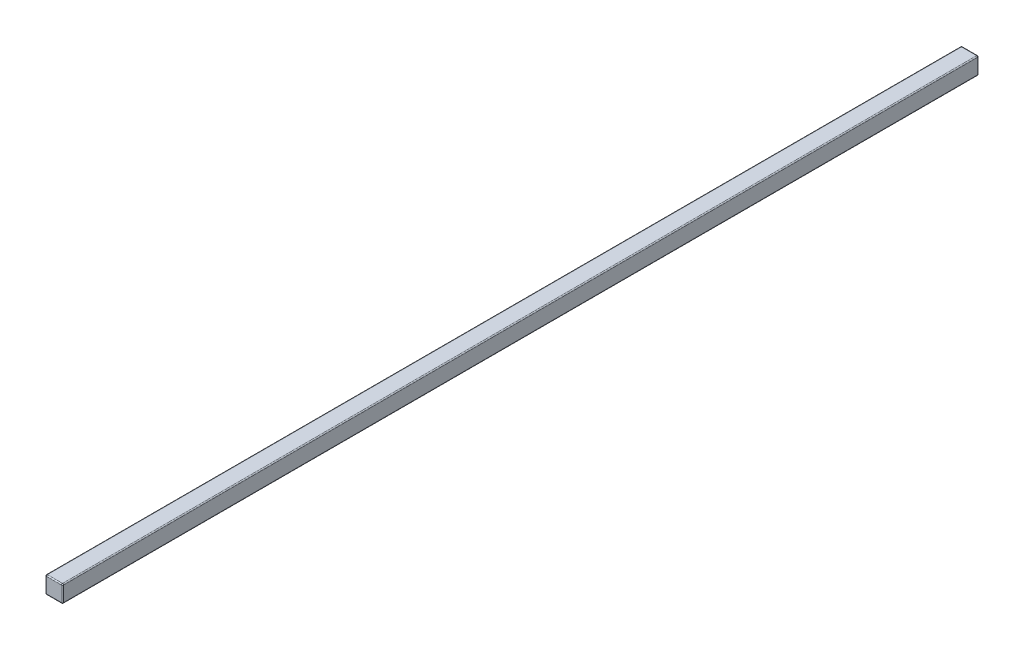
ISO-10303-21;
HEADER;
FILE_DESCRIPTION(('STEP AP214'),'2;1');
FILE_NAME('part.step','',(''),(''),'','','');
FILE_SCHEMA(('AUTOMOTIVE_DESIGN { 1 0 10303 214 1 1 1 1 }'));
ENDSEC;
DATA;
#1=APPLICATION_CONTEXT('core data for automotive mechanical design processes');
#2=APPLICATION_PROTOCOL_DEFINITION('international standard','automotive_design',2000,#1);
#3=PRODUCT_CONTEXT('',#1,'mechanical');
#4=PRODUCT('Part','Part','',(#3));
#5=PRODUCT_RELATED_PRODUCT_CATEGORY('part','',(#4));
#6=PRODUCT_DEFINITION_FORMATION('','',#4);
#7=PRODUCT_DEFINITION_CONTEXT('part definition',#1,'design');
#8=PRODUCT_DEFINITION('design','',#6,#7);
#9=PRODUCT_DEFINITION_SHAPE('','',#8);
#10=(LENGTH_UNIT() NAMED_UNIT(*) SI_UNIT(.MILLI.,.METRE.));
#11=(NAMED_UNIT(*) PLANE_ANGLE_UNIT() SI_UNIT($,.RADIAN.));
#12=(NAMED_UNIT(*) SI_UNIT($,.STERADIAN.) SOLID_ANGLE_UNIT());
#13=UNCERTAINTY_MEASURE_WITH_UNIT(LENGTH_MEASURE(1.E-05),#10,'distance_accuracy_value','');
#14=(GEOMETRIC_REPRESENTATION_CONTEXT(3) GLOBAL_UNCERTAINTY_ASSIGNED_CONTEXT((#13)) GLOBAL_UNIT_ASSIGNED_CONTEXT((#10,
#11,#12)) REPRESENTATION_CONTEXT('',''));
#15=CARTESIAN_POINT('',(0.,0.,0.));
#16=DIRECTION('',(0.,0.,1.));
#17=DIRECTION('',(1.,0.,0.));
#18=AXIS2_PLACEMENT_3D('',#15,#16,#17);
#19=CARTESIAN_POINT('',(12.5,-12.5,1336.6));
#20=DIRECTION('',(-1.,0.,0.));
#21=DIRECTION('',(0.,0.,1.));
#22=AXIS2_PLACEMENT_3D('',#19,#20,#21);
#23=PLANE('',#22);
#24=DIRECTION('',(0.,1.,0.));
#25=VECTOR('',#24,1.);
#26=CARTESIAN_POINT('',(12.5,-12.5,1335.1));
#27=LINE('',#26,#25);
#28=CARTESIAN_POINT('',(12.5,11.,1335.1));
#29=VERTEX_POINT('',#28);
#30=CARTESIAN_POINT('',(12.5,-11.,1335.1));
#31=VERTEX_POINT('',#30);
#32=EDGE_CURVE('E162',#29,#31,#27,.F.);
#33=ORIENTED_EDGE('',*,*,#32,.T.);
#34=DIRECTION('',(0.,0.,-1.));
#35=VECTOR('',#34,1.);
#36=CARTESIAN_POINT('',(12.5,-11.,1336.6));
#37=LINE('',#36,#35);
#38=CARTESIAN_POINT('',(12.5,-11.,1.50000000000006));
#39=VERTEX_POINT('',#38);
#40=EDGE_CURVE('E265',#31,#39,#37,.T.);
#41=ORIENTED_EDGE('',*,*,#40,.T.);
#42=DIRECTION('',(0.,1.,0.));
#43=VECTOR('',#42,1.);
#44=CARTESIAN_POINT('',(12.5,12.5,1.50000000000006));
#45=LINE('',#44,#43);
#46=CARTESIAN_POINT('',(12.5,11.,1.50000000000006));
#47=VERTEX_POINT('',#46);
#48=EDGE_CURVE('E260',#39,#47,#45,.T.);
#49=ORIENTED_EDGE('',*,*,#48,.T.);
#50=DIRECTION('',(0.,0.,-1.));
#51=VECTOR('',#50,1.);
#52=CARTESIAN_POINT('',(12.5,11.,1336.6));
#53=LINE('',#52,#51);
#54=EDGE_CURVE('E257',#47,#29,#53,.F.);
#55=ORIENTED_EDGE('',*,*,#54,.T.);
#56=EDGE_LOOP('',(#33,#41,#49,#55));
#57=FACE_BOUND('',#56,.T.);
#58=ADVANCED_FACE('F39',(#57),#23,.F.);
#59=CARTESIAN_POINT('',(-12.5,12.5,1336.6));
#60=DIRECTION('',(0.,-1.,0.));
#61=DIRECTION('',(0.,0.,-1.));
#62=AXIS2_PLACEMENT_3D('',#59,#60,#61);
#63=PLANE('',#62);
#64=DIRECTION('',(-1.,0.,0.));
#65=VECTOR('',#64,1.);
#66=CARTESIAN_POINT('',(-12.5,12.5,1335.1));
#67=LINE('',#66,#65);
#68=CARTESIAN_POINT('',(-11.,12.5,1335.1));
#69=VERTEX_POINT('',#68);
#70=CARTESIAN_POINT('',(11.,12.5,1335.1));
#71=VERTEX_POINT('',#70);
#72=EDGE_CURVE('E49',#69,#71,#67,.F.);
#73=ORIENTED_EDGE('',*,*,#72,.T.);
#74=DIRECTION('',(0.,0.,-1.));
#75=VECTOR('',#74,1.);
#76=CARTESIAN_POINT('',(11.,12.5,1336.6));
#77=LINE('',#76,#75);
#78=CARTESIAN_POINT('',(11.,12.5,1.50000000000006));
#79=VERTEX_POINT('',#78);
#80=EDGE_CURVE('E11',#71,#79,#77,.T.);
#81=ORIENTED_EDGE('',*,*,#80,.T.);
#82=DIRECTION('',(-1.,0.,0.));
#83=VECTOR('',#82,1.);
#84=CARTESIAN_POINT('',(-12.5,12.5,1.50000000000006));
#85=LINE('',#84,#83);
#86=CARTESIAN_POINT('',(-11.,12.5,1.50000000000006));
#87=VERTEX_POINT('',#86);
#88=EDGE_CURVE('E269',#79,#87,#85,.T.);
#89=ORIENTED_EDGE('',*,*,#88,.T.);
#90=DIRECTION('',(0.,0.,-1.));
#91=VECTOR('',#90,1.);
#92=CARTESIAN_POINT('',(-11.,12.5,1336.6));
#93=LINE('',#92,#91);
#94=EDGE_CURVE('E60',#87,#69,#93,.F.);
#95=ORIENTED_EDGE('',*,*,#94,.T.);
#96=EDGE_LOOP('',(#73,#81,#89,#95));
#97=FACE_BOUND('',#96,.T.);
#98=ADVANCED_FACE('F378',(#97),#63,.F.);
#99=CARTESIAN_POINT('',(-12.5,-12.5,1336.6));
#100=DIRECTION('',(1.,0.,0.));
#101=DIRECTION('',(0.,0.,-1.));
#102=AXIS2_PLACEMENT_3D('',#99,#100,#101);
#103=PLANE('',#102);
#104=DIRECTION('',(0.,0.,-1.));
#105=VECTOR('',#104,1.);
#106=CARTESIAN_POINT('',(-12.5,-11.,1336.6));
#107=LINE('',#106,#105);
#108=CARTESIAN_POINT('',(-12.5,-11.,1.50000000000006));
#109=VERTEX_POINT('',#108);
#110=CARTESIAN_POINT('',(-12.5,-11.,1335.1));
#111=VERTEX_POINT('',#110);
#112=EDGE_CURVE('E243',#109,#111,#107,.F.);
#113=ORIENTED_EDGE('',*,*,#112,.T.);
#114=DIRECTION('',(0.,-1.,0.));
#115=VECTOR('',#114,1.);
#116=CARTESIAN_POINT('',(-12.5,-12.5,1335.1));
#117=LINE('',#116,#115);
#118=CARTESIAN_POINT('',(-12.5,11.,1335.1));
#119=VERTEX_POINT('',#118);
#120=EDGE_CURVE('E248',#111,#119,#117,.F.);
#121=ORIENTED_EDGE('',*,*,#120,.T.);
#122=DIRECTION('',(0.,0.,-1.));
#123=VECTOR('',#122,1.);
#124=CARTESIAN_POINT('',(-12.5,11.,1336.6));
#125=LINE('',#124,#123);
#126=CARTESIAN_POINT('',(-12.5,11.,1.50000000000006));
#127=VERTEX_POINT('',#126);
#128=EDGE_CURVE('E244',#119,#127,#125,.T.);
#129=ORIENTED_EDGE('',*,*,#128,.T.);
#130=DIRECTION('',(0.,-1.,0.));
#131=VECTOR('',#130,1.);
#132=CARTESIAN_POINT('',(-12.5,-12.5,1.50000000000006));
#133=LINE('',#132,#131);
#134=EDGE_CURVE('E239',#127,#109,#133,.T.);
#135=ORIENTED_EDGE('',*,*,#134,.T.);
#136=EDGE_LOOP('',(#113,#121,#129,#135));
#137=FACE_BOUND('',#136,.T.);
#138=ADVANCED_FACE('F360',(#137),#103,.F.);
#139=CARTESIAN_POINT('',(-12.5,-12.5,1336.6));
#140=DIRECTION('',(0.,1.,0.));
#141=DIRECTION('',(0.,0.,1.));
#142=AXIS2_PLACEMENT_3D('',#139,#140,#141);
#143=PLANE('',#142);
#144=DIRECTION('',(1.,0.,0.));
#145=VECTOR('',#144,1.);
#146=CARTESIAN_POINT('',(-12.5,-12.5,1335.1));
#147=LINE('',#146,#145);
#148=CARTESIAN_POINT('',(11.,-12.5,1335.1));
#149=VERTEX_POINT('',#148);
#150=CARTESIAN_POINT('',(-11.,-12.5,1335.1));
#151=VERTEX_POINT('',#150);
#152=EDGE_CURVE('E310',#149,#151,#147,.F.);
#153=ORIENTED_EDGE('',*,*,#152,.T.);
#154=DIRECTION('',(0.,0.,-1.));
#155=VECTOR('',#154,1.);
#156=CARTESIAN_POINT('',(-11.,-12.5,1336.6));
#157=LINE('',#156,#155);
#158=CARTESIAN_POINT('',(-11.,-12.5,1.50000000000006));
#159=VERTEX_POINT('',#158);
#160=EDGE_CURVE('E303',#151,#159,#157,.T.);
#161=ORIENTED_EDGE('',*,*,#160,.T.);
#162=DIRECTION('',(1.,0.,0.));
#163=VECTOR('',#162,1.);
#164=CARTESIAN_POINT('',(12.5,-12.5,1.50000000000006));
#165=LINE('',#164,#163);
#166=CARTESIAN_POINT('',(11.,-12.5,1.50000000000006));
#167=VERTEX_POINT('',#166);
#168=EDGE_CURVE('E320',#159,#167,#165,.T.);
#169=ORIENTED_EDGE('',*,*,#168,.T.);
#170=DIRECTION('',(0.,0.,-1.));
#171=VECTOR('',#170,1.);
#172=CARTESIAN_POINT('',(11.,-12.5,1336.6));
#173=LINE('',#172,#171);
#174=EDGE_CURVE('E315',#167,#149,#173,.F.);
#175=ORIENTED_EDGE('',*,*,#174,.T.);
#176=EDGE_LOOP('',(#153,#161,#169,#175));
#177=FACE_BOUND('',#176,.T.);
#178=ADVANCED_FACE('F313',(#177),#143,.F.);
#179=CARTESIAN_POINT('',(0.,0.,1336.6));
#180=DIRECTION('',(0.,0.,-1.));
#181=DIRECTION('',(-1.,0.,0.));
#182=AXIS2_PLACEMENT_3D('',#179,#180,#181);
#183=PLANE('',#182);
#184=DIRECTION('',(0.,-1.,0.));
#185=VECTOR('',#184,1.);
#186=CARTESIAN_POINT('',(-11.,0.,1336.6));
#187=LINE('',#186,#185);
#188=CARTESIAN_POINT('',(-11.,11.,1336.6));
#189=VERTEX_POINT('',#188);
#190=CARTESIAN_POINT('',(-11.,-11.,1336.6));
#191=VERTEX_POINT('',#190);
#192=EDGE_CURVE('E139',#189,#191,#187,.T.);
#193=ORIENTED_EDGE('',*,*,#192,.T.);
#194=DIRECTION('',(1.,0.,0.));
#195=VECTOR('',#194,1.);
#196=CARTESIAN_POINT('',(0.,-11.,1336.6));
#197=LINE('',#196,#195);
#198=CARTESIAN_POINT('',(11.,-11.,1336.6));
#199=VERTEX_POINT('',#198);
#200=EDGE_CURVE('E134',#191,#199,#197,.T.);
#201=ORIENTED_EDGE('',*,*,#200,.T.);
#202=DIRECTION('',(0.,1.,0.));
#203=VECTOR('',#202,1.);
#204=CARTESIAN_POINT('',(11.,0.,1336.6));
#205=LINE('',#204,#203);
#206=CARTESIAN_POINT('',(11.,11.,1336.6));
#207=VERTEX_POINT('',#206);
#208=EDGE_CURVE('E128',#199,#207,#205,.T.);
#209=ORIENTED_EDGE('',*,*,#208,.T.);
#210=DIRECTION('',(-1.,0.,0.));
#211=VECTOR('',#210,1.);
#212=CARTESIAN_POINT('',(0.,11.,1336.6));
#213=LINE('',#212,#211);
#214=EDGE_CURVE('E131',#207,#189,#213,.T.);
#215=ORIENTED_EDGE('',*,*,#214,.T.);
#216=EDGE_LOOP('',(#193,#201,#209,#215));
#217=FACE_BOUND('',#216,.T.);
#218=ADVANCED_FACE('F130',(#217),#183,.F.);
#219=CARTESIAN_POINT('',(0.,0.,0.));
#220=DIRECTION('',(0.,0.,-1.));
#221=DIRECTION('',(-1.,0.,0.));
#222=AXIS2_PLACEMENT_3D('',#219,#220,#221);
#223=PLANE('',#222);
#224=DIRECTION('',(0.,1.,0.));
#225=VECTOR('',#224,1.);
#226=CARTESIAN_POINT('',(11.,-12.5,0.));
#227=LINE('',#226,#225);
#228=CARTESIAN_POINT('',(11.,11.,0.));
#229=VERTEX_POINT('',#228);
#230=CARTESIAN_POINT('',(11.,-11.,0.));
#231=VERTEX_POINT('',#230);
#232=EDGE_CURVE('E328',#229,#231,#227,.F.);
#233=ORIENTED_EDGE('',*,*,#232,.T.);
#234=DIRECTION('',(1.,0.,0.));
#235=VECTOR('',#234,1.);
#236=CARTESIAN_POINT('',(-12.5,-11.,0.));
#237=LINE('',#236,#235);
#238=CARTESIAN_POINT('',(-11.,-11.,0.));
#239=VERTEX_POINT('',#238);
#240=EDGE_CURVE('E250',#231,#239,#237,.F.);
#241=ORIENTED_EDGE('',*,*,#240,.T.);
#242=DIRECTION('',(0.,-1.,0.));
#243=VECTOR('',#242,1.);
#244=CARTESIAN_POINT('',(-11.,12.5,0.));
#245=LINE('',#244,#243);
#246=CARTESIAN_POINT('',(-11.,11.,0.));
#247=VERTEX_POINT('',#246);
#248=EDGE_CURVE('E237',#239,#247,#245,.F.);
#249=ORIENTED_EDGE('',*,*,#248,.T.);
#250=DIRECTION('',(-1.,0.,0.));
#251=VECTOR('',#250,1.);
#252=CARTESIAN_POINT('',(12.5,11.,0.));
#253=LINE('',#252,#251);
#254=EDGE_CURVE('E309',#247,#229,#253,.F.);
#255=ORIENTED_EDGE('',*,*,#254,.T.);
#256=EDGE_LOOP('',(#233,#241,#249,#255));
#257=FACE_BOUND('',#256,.T.);
#258=ADVANCED_FACE('F335',(#257),#223,.T.);
#259=CARTESIAN_POINT('',(-12.5,11.,1.50000000000006));
#260=DIRECTION('',(1.,0.,0.));
#261=DIRECTION('',(0.,0.,-1.));
#262=AXIS2_PLACEMENT_3D('',#259,#260,#261);
#263=CYLINDRICAL_SURFACE('',#262,1.5);
#264=CARTESIAN_POINT('',(-11.,11.,1.50000000000006));
#265=DIRECTION('',(-1.,0.,0.));
#266=DIRECTION('',(0.,0.,1.));
#267=AXIS2_PLACEMENT_3D('',#264,#265,#266);
#268=CIRCLE('',#267,1.5);
#269=EDGE_CURVE('E43',#87,#247,#268,.T.);
#270=ORIENTED_EDGE('',*,*,#269,.F.);
#271=ORIENTED_EDGE('',*,*,#88,.F.);
#272=CARTESIAN_POINT('',(11.,11.,1.5));
#273=DIRECTION('',(1.,0.,0.));
#274=DIRECTION('',(0.,1.,0.));
#275=AXIS2_PLACEMENT_3D('',#272,#273,#274);
#276=CIRCLE('',#275,1.5);
#277=EDGE_CURVE('E215',#229,#79,#276,.T.);
#278=ORIENTED_EDGE('',*,*,#277,.F.);
#279=ORIENTED_EDGE('',*,*,#254,.F.);
#280=EDGE_LOOP('',(#270,#271,#278,#279));
#281=FACE_BOUND('',#280,.T.);
#282=ADVANCED_FACE('F41',(#281),#263,.T.);
#283=CARTESIAN_POINT('',(-11.,11.,1.5));
#284=DIRECTION('',(0.,0.,1.));
#285=DIRECTION('',(1.,0.,0.));
#286=AXIS2_PLACEMENT_3D('',#283,#284,#285);
#287=SPHERICAL_SURFACE('',#286,1.5);
#288=CARTESIAN_POINT('',(-11.,11.,1.50000000000006));
#289=DIRECTION('',(0.,0.,-1.));
#290=DIRECTION('',(-1.,0.,0.));
#291=AXIS2_PLACEMENT_3D('',#288,#289,#290);
#292=CIRCLE('',#291,1.5);
#293=EDGE_CURVE('E208',#87,#127,#292,.F.);
#294=ORIENTED_EDGE('',*,*,#293,.F.);
#295=ORIENTED_EDGE('',*,*,#269,.T.);
#296=CARTESIAN_POINT('',(-11.,11.,1.5));
#297=DIRECTION('',(0.,1.,0.));
#298=DIRECTION('',(-1.,0.,0.));
#299=AXIS2_PLACEMENT_3D('',#296,#297,#298);
#300=CIRCLE('',#299,1.5);
#301=EDGE_CURVE('E212',#127,#247,#300,.F.);
#302=ORIENTED_EDGE('',*,*,#301,.F.);
#303=EDGE_LOOP('',(#294,#295,#302));
#304=FACE_BOUND('',#303,.T.);
#305=ADVANCED_FACE('F229',(#304),#287,.T.);
#306=CARTESIAN_POINT('',(11.,11.,1.5));
#307=DIRECTION('',(0.,0.,1.));
#308=DIRECTION('',(1.,0.,0.));
#309=AXIS2_PLACEMENT_3D('',#306,#307,#308);
#310=SPHERICAL_SURFACE('',#309,1.5);
#311=CARTESIAN_POINT('',(11.,11.,1.50000000000006));
#312=DIRECTION('',(0.,1.,0.));
#313=DIRECTION('',(0.,0.,1.));
#314=AXIS2_PLACEMENT_3D('',#311,#312,#313);
#315=CIRCLE('',#314,1.5);
#316=EDGE_CURVE('E201',#229,#47,#315,.F.);
#317=ORIENTED_EDGE('',*,*,#316,.F.);
#318=ORIENTED_EDGE('',*,*,#277,.T.);
#319=CARTESIAN_POINT('',(11.,11.,1.50000000000006));
#320=DIRECTION('',(0.,0.,-1.));
#321=DIRECTION('',(-1.,0.,0.));
#322=AXIS2_PLACEMENT_3D('',#319,#320,#321);
#323=CIRCLE('',#322,1.5);
#324=EDGE_CURVE('E205',#47,#79,#323,.F.);
#325=ORIENTED_EDGE('',*,*,#324,.F.);
#326=EDGE_LOOP('',(#317,#318,#325));
#327=FACE_BOUND('',#326,.T.);
#328=ADVANCED_FACE('F512',(#327),#310,.T.);
#329=CARTESIAN_POINT('',(-11.,-12.5,1.50000000000006));
#330=DIRECTION('',(0.,1.,0.));
#331=DIRECTION('',(0.,0.,1.));
#332=AXIS2_PLACEMENT_3D('',#329,#330,#331);
#333=CYLINDRICAL_SURFACE('',#332,1.5);
#334=ORIENTED_EDGE('',*,*,#301,.T.);
#335=ORIENTED_EDGE('',*,*,#248,.F.);
#336=CARTESIAN_POINT('',(-11.,-11.,1.50000000000006));
#337=DIRECTION('',(0.,-1.,0.));
#338=DIRECTION('',(0.,0.,-1.));
#339=AXIS2_PLACEMENT_3D('',#336,#337,#338);
#340=CIRCLE('',#339,1.5);
#341=EDGE_CURVE('E194',#109,#239,#340,.T.);
#342=ORIENTED_EDGE('',*,*,#341,.F.);
#343=ORIENTED_EDGE('',*,*,#134,.F.);
#344=EDGE_LOOP('',(#334,#335,#342,#343));
#345=FACE_BOUND('',#344,.T.);
#346=ADVANCED_FACE('F235',(#345),#333,.T.);
#347=CARTESIAN_POINT('',(-11.,11.,1336.6));
#348=DIRECTION('',(0.,0.,-1.));
#349=DIRECTION('',(-1.,0.,0.));
#350=AXIS2_PLACEMENT_3D('',#347,#348,#349);
#351=CYLINDRICAL_SURFACE('',#350,1.5);
#352=ORIENTED_EDGE('',*,*,#293,.T.);
#353=ORIENTED_EDGE('',*,*,#128,.F.);
#354=CARTESIAN_POINT('',(-11.,11.,1335.1));
#355=DIRECTION('',(0.,0.,1.));
#356=DIRECTION('',(1.,0.,0.));
#357=AXIS2_PLACEMENT_3D('',#354,#355,#356);
#358=CIRCLE('',#357,1.5);
#359=EDGE_CURVE('E190',#69,#119,#358,.T.);
#360=ORIENTED_EDGE('',*,*,#359,.F.);
#361=ORIENTED_EDGE('',*,*,#94,.F.);
#362=EDGE_LOOP('',(#352,#353,#360,#361));
#363=FACE_BOUND('',#362,.T.);
#364=ADVANCED_FACE('F364',(#363),#351,.T.);
#365=CARTESIAN_POINT('',(0.,11.,1335.1));
#366=DIRECTION('',(-1.,0.,0.));
#367=DIRECTION('',(0.,0.,1.));
#368=AXIS2_PLACEMENT_3D('',#365,#366,#367);
#369=CYLINDRICAL_SURFACE('',#368,1.5);
#370=CARTESIAN_POINT('',(11.,11.,1335.1));
#371=DIRECTION('',(1.,0.,0.));
#372=DIRECTION('',(0.,0.,-1.));
#373=AXIS2_PLACEMENT_3D('',#370,#371,#372);
#374=CIRCLE('',#373,1.5);
#375=EDGE_CURVE('E145',#71,#207,#374,.T.);
#376=ORIENTED_EDGE('',*,*,#375,.F.);
#377=ORIENTED_EDGE('',*,*,#72,.F.);
#378=CARTESIAN_POINT('',(-11.,11.,1335.1));
#379=DIRECTION('',(-1.,0.,0.));
#380=DIRECTION('',(0.,0.,1.));
#381=AXIS2_PLACEMENT_3D('',#378,#379,#380);
#382=CIRCLE('',#381,1.5);
#383=EDGE_CURVE('E148',#189,#69,#382,.T.);
#384=ORIENTED_EDGE('',*,*,#383,.F.);
#385=ORIENTED_EDGE('',*,*,#214,.F.);
#386=EDGE_LOOP('',(#376,#377,#384,#385));
#387=FACE_BOUND('',#386,.T.);
#388=ADVANCED_FACE('F144',(#387),#369,.T.);
#389=CARTESIAN_POINT('',(11.,11.,1336.6));
#390=DIRECTION('',(0.,0.,-1.));
#391=DIRECTION('',(-1.,0.,0.));
#392=AXIS2_PLACEMENT_3D('',#389,#390,#391);
#393=CYLINDRICAL_SURFACE('',#392,1.5);
#394=ORIENTED_EDGE('',*,*,#324,.T.);
#395=ORIENTED_EDGE('',*,*,#80,.F.);
#396=CARTESIAN_POINT('',(11.,11.,1335.1));
#397=DIRECTION('',(0.,0.,1.));
#398=DIRECTION('',(1.,0.,0.));
#399=AXIS2_PLACEMENT_3D('',#396,#397,#398);
#400=CIRCLE('',#399,1.5);
#401=EDGE_CURVE('E158',#29,#71,#400,.T.);
#402=ORIENTED_EDGE('',*,*,#401,.F.);
#403=ORIENTED_EDGE('',*,*,#54,.F.);
#404=EDGE_LOOP('',(#394,#395,#402,#403));
#405=FACE_BOUND('',#404,.T.);
#406=ADVANCED_FACE('F481',(#405),#393,.T.);
#407=CARTESIAN_POINT('',(11.,-12.5,1.50000000000006));
#408=DIRECTION('',(0.,-1.,0.));
#409=DIRECTION('',(0.,0.,-1.));
#410=AXIS2_PLACEMENT_3D('',#407,#408,#409);
#411=CYLINDRICAL_SURFACE('',#410,1.5);
#412=ORIENTED_EDGE('',*,*,#316,.T.);
#413=ORIENTED_EDGE('',*,*,#48,.F.);
#414=CARTESIAN_POINT('',(11.,-11.,1.5));
#415=DIRECTION('',(0.,-1.,0.));
#416=DIRECTION('',(0.,0.,-1.));
#417=AXIS2_PLACEMENT_3D('',#414,#415,#416);
#418=CIRCLE('',#417,1.5);
#419=EDGE_CURVE('E182',#231,#39,#418,.T.);
#420=ORIENTED_EDGE('',*,*,#419,.F.);
#421=ORIENTED_EDGE('',*,*,#232,.F.);
#422=EDGE_LOOP('',(#412,#413,#420,#421));
#423=FACE_BOUND('',#422,.T.);
#424=ADVANCED_FACE('F345',(#423),#411,.T.);
#425=CARTESIAN_POINT('',(-12.5,-11.,1.50000000000006));
#426=DIRECTION('',(-1.,0.,0.));
#427=DIRECTION('',(0.,0.,1.));
#428=AXIS2_PLACEMENT_3D('',#425,#426,#427);
#429=CYLINDRICAL_SURFACE('',#428,1.5);
#430=CARTESIAN_POINT('',(-11.,-11.,1.5));
#431=DIRECTION('',(-1.,0.,0.));
#432=DIRECTION('',(0.,0.,1.));
#433=AXIS2_PLACEMENT_3D('',#430,#431,#432);
#434=CIRCLE('',#433,1.5);
#435=EDGE_CURVE('E197',#239,#159,#434,.T.);
#436=ORIENTED_EDGE('',*,*,#435,.F.);
#437=ORIENTED_EDGE('',*,*,#240,.F.);
#438=CARTESIAN_POINT('',(11.,-11.,1.50000000000006));
#439=DIRECTION('',(1.,0.,0.));
#440=DIRECTION('',(0.,0.,-1.));
#441=AXIS2_PLACEMENT_3D('',#438,#439,#440);
#442=CIRCLE('',#441,1.5);
#443=EDGE_CURVE('E178',#167,#231,#442,.T.);
#444=ORIENTED_EDGE('',*,*,#443,.F.);
#445=ORIENTED_EDGE('',*,*,#168,.F.);
#446=EDGE_LOOP('',(#436,#437,#444,#445));
#447=FACE_BOUND('',#446,.T.);
#448=ADVANCED_FACE('F341',(#447),#429,.T.);
#449=CARTESIAN_POINT('',(-11.,-11.,1.5));
#450=DIRECTION('',(0.,0.,1.));
#451=DIRECTION('',(1.,0.,0.));
#452=AXIS2_PLACEMENT_3D('',#449,#450,#451);
#453=SPHERICAL_SURFACE('',#452,1.5);
#454=ORIENTED_EDGE('',*,*,#341,.T.);
#455=ORIENTED_EDGE('',*,*,#435,.T.);
#456=CARTESIAN_POINT('',(-11.,-11.,1.50000000000006));
#457=DIRECTION('',(0.,0.,-1.));
#458=DIRECTION('',(-1.,0.,0.));
#459=AXIS2_PLACEMENT_3D('',#456,#457,#458);
#460=CIRCLE('',#459,1.5);
#461=EDGE_CURVE('E169',#109,#159,#460,.F.);
#462=ORIENTED_EDGE('',*,*,#461,.F.);
#463=EDGE_LOOP('',(#454,#455,#462));
#464=FACE_BOUND('',#463,.T.);
#465=ADVANCED_FACE('F368',(#464),#453,.T.);
#466=CARTESIAN_POINT('',(-11.,11.,1335.1));
#467=DIRECTION('',(0.,0.,1.));
#468=DIRECTION('',(1.,0.,0.));
#469=AXIS2_PLACEMENT_3D('',#466,#467,#468);
#470=SPHERICAL_SURFACE('',#469,1.5);
#471=ORIENTED_EDGE('',*,*,#383,.T.);
#472=ORIENTED_EDGE('',*,*,#359,.T.);
#473=CARTESIAN_POINT('',(-11.,11.,1335.1));
#474=DIRECTION('',(0.,1.,0.));
#475=DIRECTION('',(0.,0.,1.));
#476=AXIS2_PLACEMENT_3D('',#473,#474,#475);
#477=CIRCLE('',#476,1.5);
#478=EDGE_CURVE('E164',#189,#119,#477,.F.);
#479=ORIENTED_EDGE('',*,*,#478,.F.);
#480=EDGE_LOOP('',(#471,#472,#479));
#481=FACE_BOUND('',#480,.T.);
#482=ADVANCED_FACE('F366',(#481),#470,.T.);
#483=CARTESIAN_POINT('',(11.,11.,1335.1));
#484=DIRECTION('',(0.,0.,1.));
#485=DIRECTION('',(1.,0.,0.));
#486=AXIS2_PLACEMENT_3D('',#483,#484,#485);
#487=SPHERICAL_SURFACE('',#486,1.5);
#488=ORIENTED_EDGE('',*,*,#401,.T.);
#489=ORIENTED_EDGE('',*,*,#375,.T.);
#490=CARTESIAN_POINT('',(11.,11.,1335.1));
#491=DIRECTION('',(0.,1.,0.));
#492=DIRECTION('',(0.,0.,1.));
#493=AXIS2_PLACEMENT_3D('',#490,#491,#492);
#494=CIRCLE('',#493,1.5);
#495=EDGE_CURVE('E155',#29,#207,#494,.F.);
#496=ORIENTED_EDGE('',*,*,#495,.F.);
#497=EDGE_LOOP('',(#488,#489,#496));
#498=FACE_BOUND('',#497,.T.);
#499=ADVANCED_FACE('F154',(#498),#487,.T.);
#500=CARTESIAN_POINT('',(11.,-11.,1.5));
#501=DIRECTION('',(0.,0.,1.));
#502=DIRECTION('',(1.,0.,0.));
#503=AXIS2_PLACEMENT_3D('',#500,#501,#502);
#504=SPHERICAL_SURFACE('',#503,1.5);
#505=ORIENTED_EDGE('',*,*,#443,.T.);
#506=ORIENTED_EDGE('',*,*,#419,.T.);
#507=CARTESIAN_POINT('',(11.,-11.,1.50000000000006));
#508=DIRECTION('',(0.,0.,-1.));
#509=DIRECTION('',(-1.,0.,0.));
#510=AXIS2_PLACEMENT_3D('',#507,#508,#509);
#511=CIRCLE('',#510,1.5);
#512=EDGE_CURVE('E165',#167,#39,#511,.F.);
#513=ORIENTED_EDGE('',*,*,#512,.F.);
#514=EDGE_LOOP('',(#505,#506,#513));
#515=FACE_BOUND('',#514,.T.);
#516=ADVANCED_FACE('F347',(#515),#504,.T.);
#517=CARTESIAN_POINT('',(-11.,-11.,1336.6));
#518=DIRECTION('',(0.,0.,-1.));
#519=DIRECTION('',(-1.,0.,0.));
#520=AXIS2_PLACEMENT_3D('',#517,#518,#519);
#521=CYLINDRICAL_SURFACE('',#520,1.5);
#522=ORIENTED_EDGE('',*,*,#461,.T.);
#523=ORIENTED_EDGE('',*,*,#160,.F.);
#524=CARTESIAN_POINT('',(-11.,-11.,1335.1));
#525=DIRECTION('',(0.,0.,1.));
#526=DIRECTION('',(1.,0.,0.));
#527=AXIS2_PLACEMENT_3D('',#524,#525,#526);
#528=CIRCLE('',#527,1.5);
#529=EDGE_CURVE('E171',#111,#151,#528,.T.);
#530=ORIENTED_EDGE('',*,*,#529,.F.);
#531=ORIENTED_EDGE('',*,*,#112,.F.);
#532=EDGE_LOOP('',(#522,#523,#530,#531));
#533=FACE_BOUND('',#532,.T.);
#534=ADVANCED_FACE('F305',(#533),#521,.T.);
#535=CARTESIAN_POINT('',(-11.,0.,1335.1));
#536=DIRECTION('',(0.,-1.,0.));
#537=DIRECTION('',(0.,0.,-1.));
#538=AXIS2_PLACEMENT_3D('',#535,#536,#537);
#539=CYLINDRICAL_SURFACE('',#538,1.5);
#540=ORIENTED_EDGE('',*,*,#478,.T.);
#541=ORIENTED_EDGE('',*,*,#120,.F.);
#542=CARTESIAN_POINT('',(-11.,-11.,1335.1));
#543=DIRECTION('',(0.,-1.,0.));
#544=DIRECTION('',(0.,0.,-1.));
#545=AXIS2_PLACEMENT_3D('',#542,#543,#544);
#546=CIRCLE('',#545,1.5);
#547=EDGE_CURVE('E290',#191,#111,#546,.T.);
#548=ORIENTED_EDGE('',*,*,#547,.F.);
#549=ORIENTED_EDGE('',*,*,#192,.F.);
#550=EDGE_LOOP('',(#540,#541,#548,#549));
#551=FACE_BOUND('',#550,.T.);
#552=ADVANCED_FACE('F359',(#551),#539,.T.);
#553=CARTESIAN_POINT('',(11.,0.,1335.1));
#554=DIRECTION('',(0.,1.,0.));
#555=DIRECTION('',(0.,0.,1.));
#556=AXIS2_PLACEMENT_3D('',#553,#554,#555);
#557=CYLINDRICAL_SURFACE('',#556,1.5);
#558=ORIENTED_EDGE('',*,*,#495,.T.);
#559=ORIENTED_EDGE('',*,*,#208,.F.);
#560=CARTESIAN_POINT('',(11.,-11.,1335.1));
#561=DIRECTION('',(0.,-1.,0.));
#562=DIRECTION('',(0.,0.,-1.));
#563=AXIS2_PLACEMENT_3D('',#560,#561,#562);
#564=CIRCLE('',#563,1.5);
#565=EDGE_CURVE('E286',#31,#199,#564,.T.);
#566=ORIENTED_EDGE('',*,*,#565,.F.);
#567=ORIENTED_EDGE('',*,*,#32,.F.);
#568=EDGE_LOOP('',(#558,#559,#566,#567));
#569=FACE_BOUND('',#568,.T.);
#570=ADVANCED_FACE('F161',(#569),#557,.T.);
#571=CARTESIAN_POINT('',(11.,-11.,1336.6));
#572=DIRECTION('',(0.,0.,-1.));
#573=DIRECTION('',(-1.,0.,0.));
#574=AXIS2_PLACEMENT_3D('',#571,#572,#573);
#575=CYLINDRICAL_SURFACE('',#574,1.5);
#576=ORIENTED_EDGE('',*,*,#512,.T.);
#577=ORIENTED_EDGE('',*,*,#40,.F.);
#578=CARTESIAN_POINT('',(11.,-11.,1335.1));
#579=DIRECTION('',(0.,0.,1.));
#580=DIRECTION('',(1.,0.,0.));
#581=AXIS2_PLACEMENT_3D('',#578,#579,#580);
#582=CIRCLE('',#581,1.5);
#583=EDGE_CURVE('E282',#149,#31,#582,.T.);
#584=ORIENTED_EDGE('',*,*,#583,.F.);
#585=ORIENTED_EDGE('',*,*,#174,.F.);
#586=EDGE_LOOP('',(#576,#577,#584,#585));
#587=FACE_BOUND('',#586,.T.);
#588=ADVANCED_FACE('F350',(#587),#575,.T.);
#589=CARTESIAN_POINT('',(-11.,-11.,1335.1));
#590=DIRECTION('',(0.,0.,1.));
#591=DIRECTION('',(1.,0.,0.));
#592=AXIS2_PLACEMENT_3D('',#589,#590,#591);
#593=SPHERICAL_SURFACE('',#592,1.5);
#594=ORIENTED_EDGE('',*,*,#547,.T.);
#595=ORIENTED_EDGE('',*,*,#529,.T.);
#596=CARTESIAN_POINT('',(-11.,-11.,1335.1));
#597=DIRECTION('',(-1.,0.,0.));
#598=DIRECTION('',(0.,0.,1.));
#599=AXIS2_PLACEMENT_3D('',#596,#597,#598);
#600=CIRCLE('',#599,1.5);
#601=EDGE_CURVE('E279',#191,#151,#600,.F.);
#602=ORIENTED_EDGE('',*,*,#601,.F.);
#603=EDGE_LOOP('',(#594,#595,#602));
#604=FACE_BOUND('',#603,.T.);
#605=ADVANCED_FACE('F299',(#604),#593,.T.);
#606=CARTESIAN_POINT('',(11.,-11.,1335.1));
#607=DIRECTION('',(0.,0.,1.));
#608=DIRECTION('',(1.,0.,0.));
#609=AXIS2_PLACEMENT_3D('',#606,#607,#608);
#610=SPHERICAL_SURFACE('',#609,1.5);
#611=ORIENTED_EDGE('',*,*,#583,.T.);
#612=ORIENTED_EDGE('',*,*,#565,.T.);
#613=CARTESIAN_POINT('',(11.,-11.,1335.1));
#614=DIRECTION('',(1.,0.,0.));
#615=DIRECTION('',(0.,0.,-1.));
#616=AXIS2_PLACEMENT_3D('',#613,#614,#615);
#617=CIRCLE('',#616,1.5);
#618=EDGE_CURVE('E276',#149,#199,#617,.F.);
#619=ORIENTED_EDGE('',*,*,#618,.F.);
#620=EDGE_LOOP('',(#611,#612,#619));
#621=FACE_BOUND('',#620,.T.);
#622=ADVANCED_FACE('F390',(#621),#610,.T.);
#623=CARTESIAN_POINT('',(0.,-11.,1335.1));
#624=DIRECTION('',(1.,0.,0.));
#625=DIRECTION('',(0.,0.,-1.));
#626=AXIS2_PLACEMENT_3D('',#623,#624,#625);
#627=CYLINDRICAL_SURFACE('',#626,1.5);
#628=ORIENTED_EDGE('',*,*,#601,.T.);
#629=ORIENTED_EDGE('',*,*,#152,.F.);
#630=ORIENTED_EDGE('',*,*,#618,.T.);
#631=ORIENTED_EDGE('',*,*,#200,.F.);
#632=EDGE_LOOP('',(#628,#629,#630,#631));
#633=FACE_BOUND('',#632,.T.);
#634=ADVANCED_FACE('F387',(#633),#627,.T.);
#635=CLOSED_SHELL('',(#58,#98,#138,#178,#218,#258,#282,#305,#328,#346,#364,#388,#406,#424,#448,
#465,#482,#499,#516,#534,#552,#570,#588,#605,#622,#634));
#636=MANIFOLD_SOLID_BREP('B2',#635);
#637=ADVANCED_BREP_SHAPE_REPRESENTATION('',(#18,#636),#14);
#638=SHAPE_DEFINITION_REPRESENTATION(#9,#637);
ENDSEC;
END-ISO-10303-21;
